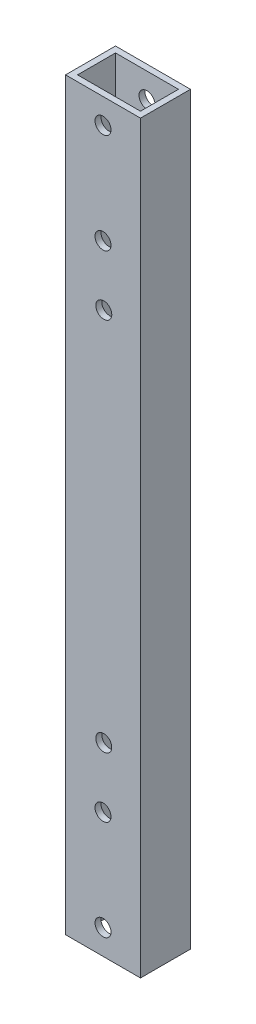
ISO-10303-21;
HEADER;
FILE_DESCRIPTION(('STEP AP214'),'2;1');
FILE_NAME('part.step','',(''),(''),'','','');
FILE_SCHEMA(('AUTOMOTIVE_DESIGN { 1 0 10303 214 1 1 1 1 }'));
ENDSEC;
DATA;
#1=APPLICATION_CONTEXT('core data for automotive mechanical design processes');
#2=APPLICATION_PROTOCOL_DEFINITION('international standard','automotive_design',2000,#1);
#3=PRODUCT_CONTEXT('',#1,'mechanical');
#4=PRODUCT('Part','Part','',(#3));
#5=PRODUCT_RELATED_PRODUCT_CATEGORY('part','',(#4));
#6=PRODUCT_DEFINITION_FORMATION('','',#4);
#7=PRODUCT_DEFINITION_CONTEXT('part definition',#1,'design');
#8=PRODUCT_DEFINITION('design','',#6,#7);
#9=PRODUCT_DEFINITION_SHAPE('','',#8);
#10=(LENGTH_UNIT() NAMED_UNIT(*) SI_UNIT(.MILLI.,.METRE.));
#11=(NAMED_UNIT(*) PLANE_ANGLE_UNIT() SI_UNIT($,.RADIAN.));
#12=(NAMED_UNIT(*) SI_UNIT($,.STERADIAN.) SOLID_ANGLE_UNIT());
#13=UNCERTAINTY_MEASURE_WITH_UNIT(LENGTH_MEASURE(1.E-05),#10,'distance_accuracy_value','');
#14=(GEOMETRIC_REPRESENTATION_CONTEXT(3) GLOBAL_UNCERTAINTY_ASSIGNED_CONTEXT((#13)) GLOBAL_UNIT_ASSIGNED_CONTEXT((#10,
#11,#12)) REPRESENTATION_CONTEXT('',''));
#15=CARTESIAN_POINT('',(0.,0.,0.));
#16=DIRECTION('',(0.,0.,1.));
#17=DIRECTION('',(1.,0.,0.));
#18=AXIS2_PLACEMENT_3D('',#15,#16,#17);
#19=CARTESIAN_POINT('',(0.,74.51,0.));
#20=DIRECTION('',(0.,1.,0.));
#21=DIRECTION('',(0.,0.,1.));
#22=AXIS2_PLACEMENT_3D('',#19,#20,#21);
#23=PLANE('',#22);
#24=DIRECTION('',(0.,0.,-1.));
#25=VECTOR('',#24,1.);
#26=CARTESIAN_POINT('',(7.5,74.51,-5.));
#27=LINE('',#26,#25);
#28=CARTESIAN_POINT('',(7.5,74.51,5.));
#29=VERTEX_POINT('',#28);
#30=CARTESIAN_POINT('',(7.5,74.51,-5.));
#31=VERTEX_POINT('',#30);
#32=EDGE_CURVE('E163',#29,#31,#27,.T.);
#33=ORIENTED_EDGE('',*,*,#32,.T.);
#34=DIRECTION('',(-1.,0.,0.));
#35=VECTOR('',#34,1.);
#36=CARTESIAN_POINT('',(-7.5,74.51,-5.));
#37=LINE('',#36,#35);
#38=CARTESIAN_POINT('',(-7.5,74.51,-5.));
#39=VERTEX_POINT('',#38);
#40=EDGE_CURVE('E167',#31,#39,#37,.T.);
#41=ORIENTED_EDGE('',*,*,#40,.T.);
#42=DIRECTION('',(0.,0.,1.));
#43=VECTOR('',#42,1.);
#44=CARTESIAN_POINT('',(-7.5,74.51,-5.));
#45=LINE('',#44,#43);
#46=CARTESIAN_POINT('',(-7.5,74.51,5.));
#47=VERTEX_POINT('',#46);
#48=EDGE_CURVE('E171',#39,#47,#45,.T.);
#49=ORIENTED_EDGE('',*,*,#48,.T.);
#50=DIRECTION('',(1.,0.,0.));
#51=VECTOR('',#50,1.);
#52=CARTESIAN_POINT('',(-7.5,74.51,5.));
#53=LINE('',#52,#51);
#54=EDGE_CURVE('E174',#47,#29,#53,.T.);
#55=ORIENTED_EDGE('',*,*,#54,.T.);
#56=EDGE_LOOP('',(#33,#41,#49,#55));
#57=FACE_BOUND('',#56,.T.);
#58=DIRECTION('',(1.,0.,0.));
#59=VECTOR('',#58,1.);
#60=CARTESIAN_POINT('',(-6.3,74.51,3.8));
#61=LINE('',#60,#59);
#62=CARTESIAN_POINT('',(-6.3,74.51,3.8));
#63=VERTEX_POINT('',#62);
#64=CARTESIAN_POINT('',(6.3,74.51,3.8));
#65=VERTEX_POINT('',#64);
#66=EDGE_CURVE('E122',#63,#65,#61,.T.);
#67=ORIENTED_EDGE('',*,*,#66,.F.);
#68=DIRECTION('',(0.,0.,1.));
#69=VECTOR('',#68,1.);
#70=CARTESIAN_POINT('',(-6.3,74.51,-3.8));
#71=LINE('',#70,#69);
#72=CARTESIAN_POINT('',(-6.3,74.51,-3.8));
#73=VERTEX_POINT('',#72);
#74=EDGE_CURVE('E113',#73,#63,#71,.T.);
#75=ORIENTED_EDGE('',*,*,#74,.F.);
#76=DIRECTION('',(-1.,0.,0.));
#77=VECTOR('',#76,1.);
#78=CARTESIAN_POINT('',(-6.3,74.51,-3.8));
#79=LINE('',#78,#77);
#80=CARTESIAN_POINT('',(6.3,74.51,-3.8));
#81=VERTEX_POINT('',#80);
#82=EDGE_CURVE('E139',#81,#73,#79,.T.);
#83=ORIENTED_EDGE('',*,*,#82,.F.);
#84=DIRECTION('',(0.,0.,-1.));
#85=VECTOR('',#84,1.);
#86=CARTESIAN_POINT('',(6.3,74.51,-3.8));
#87=LINE('',#86,#85);
#88=EDGE_CURVE('E135',#65,#81,#87,.T.);
#89=ORIENTED_EDGE('',*,*,#88,.F.);
#90=EDGE_LOOP('',(#67,#75,#83,#89));
#91=FACE_BOUND('',#90,.T.);
#92=ADVANCED_FACE('F45',(#57,#91),#23,.T.);
#93=CARTESIAN_POINT('',(0.,-74.51,0.));
#94=DIRECTION('',(0.,1.,0.));
#95=DIRECTION('',(0.,0.,1.));
#96=AXIS2_PLACEMENT_3D('',#93,#94,#95);
#97=PLANE('',#96);
#98=DIRECTION('',(0.,0.,-1.));
#99=VECTOR('',#98,1.);
#100=CARTESIAN_POINT('',(7.5,-74.51,-5.));
#101=LINE('',#100,#99);
#102=CARTESIAN_POINT('',(7.5,-74.51,5.));
#103=VERTEX_POINT('',#102);
#104=CARTESIAN_POINT('',(7.5,-74.51,-5.));
#105=VERTEX_POINT('',#104);
#106=EDGE_CURVE('E131',#103,#105,#101,.T.);
#107=ORIENTED_EDGE('',*,*,#106,.F.);
#108=DIRECTION('',(1.,0.,0.));
#109=VECTOR('',#108,1.);
#110=CARTESIAN_POINT('',(-7.5,-74.51,5.));
#111=LINE('',#110,#109);
#112=CARTESIAN_POINT('',(-7.5,-74.51,5.));
#113=VERTEX_POINT('',#112);
#114=EDGE_CURVE('E168',#113,#103,#111,.T.);
#115=ORIENTED_EDGE('',*,*,#114,.F.);
#116=DIRECTION('',(0.,0.,1.));
#117=VECTOR('',#116,1.);
#118=CARTESIAN_POINT('',(-7.5,-74.51,-5.));
#119=LINE('',#118,#117);
#120=CARTESIAN_POINT('',(-7.5,-74.51,-5.));
#121=VERTEX_POINT('',#120);
#122=EDGE_CURVE('E184',#121,#113,#119,.T.);
#123=ORIENTED_EDGE('',*,*,#122,.F.);
#124=DIRECTION('',(-1.,0.,0.));
#125=VECTOR('',#124,1.);
#126=CARTESIAN_POINT('',(-7.5,-74.51,-5.));
#127=LINE('',#126,#125);
#128=EDGE_CURVE('E181',#105,#121,#127,.T.);
#129=ORIENTED_EDGE('',*,*,#128,.F.);
#130=EDGE_LOOP('',(#107,#115,#123,#129));
#131=FACE_BOUND('',#130,.T.);
#132=DIRECTION('',(0.,0.,1.));
#133=VECTOR('',#132,1.);
#134=CARTESIAN_POINT('',(-6.3,-74.51,-3.8));
#135=LINE('',#134,#133);
#136=CARTESIAN_POINT('',(-6.3,-74.51,-3.8));
#137=VERTEX_POINT('',#136);
#138=CARTESIAN_POINT('',(-6.3,-74.51,3.8));
#139=VERTEX_POINT('',#138);
#140=EDGE_CURVE('E71',#137,#139,#135,.T.);
#141=ORIENTED_EDGE('',*,*,#140,.T.);
#142=DIRECTION('',(1.,0.,0.));
#143=VECTOR('',#142,1.);
#144=CARTESIAN_POINT('',(-6.3,-74.51,3.8));
#145=LINE('',#144,#143);
#146=CARTESIAN_POINT('',(6.3,-74.51,3.8));
#147=VERTEX_POINT('',#146);
#148=EDGE_CURVE('E129',#139,#147,#145,.T.);
#149=ORIENTED_EDGE('',*,*,#148,.T.);
#150=DIRECTION('',(0.,0.,-1.));
#151=VECTOR('',#150,1.);
#152=CARTESIAN_POINT('',(6.3,-74.51,-3.8));
#153=LINE('',#152,#151);
#154=CARTESIAN_POINT('',(6.3,-74.51,-3.8));
#155=VERTEX_POINT('',#154);
#156=EDGE_CURVE('E150',#147,#155,#153,.T.);
#157=ORIENTED_EDGE('',*,*,#156,.T.);
#158=DIRECTION('',(-1.,0.,0.));
#159=VECTOR('',#158,1.);
#160=CARTESIAN_POINT('',(-6.3,-74.51,-3.8));
#161=LINE('',#160,#159);
#162=EDGE_CURVE('E123',#155,#137,#161,.T.);
#163=ORIENTED_EDGE('',*,*,#162,.T.);
#164=EDGE_LOOP('',(#141,#149,#157,#163));
#165=FACE_BOUND('',#164,.T.);
#166=ADVANCED_FACE('F326',(#131,#165),#97,.F.);
#167=CARTESIAN_POINT('',(7.5,74.51,-5.));
#168=DIRECTION('',(-1.,0.,0.));
#169=DIRECTION('',(0.,0.,1.));
#170=AXIS2_PLACEMENT_3D('',#167,#168,#169);
#171=PLANE('',#170);
#172=ORIENTED_EDGE('',*,*,#106,.T.);
#173=DIRECTION('',(0.,-1.,0.));
#174=VECTOR('',#173,1.);
#175=CARTESIAN_POINT('',(7.5,74.51,-5.));
#176=LINE('',#175,#174);
#177=EDGE_CURVE('E11',#31,#105,#176,.T.);
#178=ORIENTED_EDGE('',*,*,#177,.F.);
#179=ORIENTED_EDGE('',*,*,#32,.F.);
#180=DIRECTION('',(0.,-1.,0.));
#181=VECTOR('',#180,1.);
#182=CARTESIAN_POINT('',(7.5,74.51,5.));
#183=LINE('',#182,#181);
#184=EDGE_CURVE('E177',#29,#103,#183,.T.);
#185=ORIENTED_EDGE('',*,*,#184,.T.);
#186=EDGE_LOOP('',(#172,#178,#179,#185));
#187=FACE_BOUND('',#186,.T.);
#188=ADVANCED_FACE('F47',(#187),#171,.F.);
#189=CARTESIAN_POINT('',(-7.5,74.51,-5.));
#190=DIRECTION('',(0.,0.,1.));
#191=DIRECTION('',(1.,0.,0.));
#192=AXIS2_PLACEMENT_3D('',#189,#190,#191);
#193=PLANE('',#192);
#194=CARTESIAN_POINT('',(0.154999999999378,37.5790580479988,-5.));
#195=DIRECTION('',(0.,0.,-1.));
#196=DIRECTION('',(-1.,0.,0.));
#197=AXIS2_PLACEMENT_3D('',#194,#195,#196);
#198=CIRCLE('',#197,1.6);
#199=CARTESIAN_POINT('',(-1.44500000000063,37.5790580479988,-5.));
#200=VERTEX_POINT('',#199);
#201=EDGE_CURVE('E231',#200,#200,#198,.T.);
#202=ORIENTED_EDGE('',*,*,#201,.F.);
#203=EDGE_LOOP('',(#202));
#204=FACE_BOUND('',#203,.T.);
#205=CARTESIAN_POINT('',(0.150000601940453,-37.4209419520413,-5.));
#206=DIRECTION('',(0.,0.,-1.));
#207=DIRECTION('',(-1.,0.,0.));
#208=AXIS2_PLACEMENT_3D('',#205,#206,#207);
#209=CIRCLE('',#208,1.6);
#210=CARTESIAN_POINT('',(-1.44999939805955,-37.4209419520413,-5.));
#211=VERTEX_POINT('',#210);
#212=EDGE_CURVE('E237',#211,#211,#209,.T.);
#213=ORIENTED_EDGE('',*,*,#212,.F.);
#214=EDGE_LOOP('',(#213));
#215=FACE_BOUND('',#214,.T.);
#216=CARTESIAN_POINT('',(0.,-49.51,-5.));
#217=DIRECTION('',(0.,0.,-1.));
#218=DIRECTION('',(1.,0.,0.));
#219=AXIS2_PLACEMENT_3D('',#216,#217,#218);
#220=CIRCLE('',#219,1.6);
#221=CARTESIAN_POINT('',(1.6,-49.51,-5.));
#222=VERTEX_POINT('',#221);
#223=EDGE_CURVE('E214',#222,#222,#220,.T.);
#224=ORIENTED_EDGE('',*,*,#223,.F.);
#225=EDGE_LOOP('',(#224));
#226=FACE_BOUND('',#225,.T.);
#227=CARTESIAN_POINT('',(0.,-69.51,-5.));
#228=DIRECTION('',(0.,0.,-1.));
#229=DIRECTION('',(1.,0.,0.));
#230=AXIS2_PLACEMENT_3D('',#227,#228,#229);
#231=CIRCLE('',#230,1.6);
#232=CARTESIAN_POINT('',(1.6,-69.51,-5.));
#233=VERTEX_POINT('',#232);
#234=EDGE_CURVE('E259',#233,#233,#231,.T.);
#235=ORIENTED_EDGE('',*,*,#234,.F.);
#236=EDGE_LOOP('',(#235));
#237=FACE_BOUND('',#236,.T.);
#238=CARTESIAN_POINT('',(0.,49.51,-5.));
#239=DIRECTION('',(0.,0.,1.));
#240=DIRECTION('',(1.,0.,0.));
#241=AXIS2_PLACEMENT_3D('',#238,#239,#240);
#242=CIRCLE('',#241,1.6);
#243=CARTESIAN_POINT('',(1.6,49.51,-5.));
#244=VERTEX_POINT('',#243);
#245=EDGE_CURVE('E204',#244,#244,#242,.T.);
#246=ORIENTED_EDGE('',*,*,#245,.T.);
#247=EDGE_LOOP('',(#246));
#248=FACE_BOUND('',#247,.T.);
#249=CARTESIAN_POINT('',(0.,69.51,-5.));
#250=DIRECTION('',(0.,0.,1.));
#251=DIRECTION('',(1.,0.,0.));
#252=AXIS2_PLACEMENT_3D('',#249,#250,#251);
#253=CIRCLE('',#252,1.6);
#254=CARTESIAN_POINT('',(1.6,69.51,-5.));
#255=VERTEX_POINT('',#254);
#256=EDGE_CURVE('E280',#255,#255,#253,.T.);
#257=ORIENTED_EDGE('',*,*,#256,.T.);
#258=EDGE_LOOP('',(#257));
#259=FACE_BOUND('',#258,.T.);
#260=ORIENTED_EDGE('',*,*,#128,.T.);
#261=DIRECTION('',(0.,-1.,0.));
#262=VECTOR('',#261,1.);
#263=CARTESIAN_POINT('',(-7.5,74.51,-5.));
#264=LINE('',#263,#262);
#265=EDGE_CURVE('E55',#39,#121,#264,.T.);
#266=ORIENTED_EDGE('',*,*,#265,.F.);
#267=ORIENTED_EDGE('',*,*,#40,.F.);
#268=ORIENTED_EDGE('',*,*,#177,.T.);
#269=EDGE_LOOP('',(#260,#266,#267,#268));
#270=FACE_BOUND('',#269,.T.);
#271=ADVANCED_FACE('F330',(#204,#215,#226,#237,#248,#259,#270),#193,.F.);
#272=CARTESIAN_POINT('',(-7.5,74.51,-5.));
#273=DIRECTION('',(1.,0.,0.));
#274=DIRECTION('',(0.,0.,-1.));
#275=AXIS2_PLACEMENT_3D('',#272,#273,#274);
#276=PLANE('',#275);
#277=ORIENTED_EDGE('',*,*,#122,.T.);
#278=DIRECTION('',(0.,-1.,0.));
#279=VECTOR('',#278,1.);
#280=CARTESIAN_POINT('',(-7.5,74.51,5.));
#281=LINE('',#280,#279);
#282=EDGE_CURVE('E192',#47,#113,#281,.T.);
#283=ORIENTED_EDGE('',*,*,#282,.F.);
#284=ORIENTED_EDGE('',*,*,#48,.F.);
#285=ORIENTED_EDGE('',*,*,#265,.T.);
#286=EDGE_LOOP('',(#277,#283,#284,#285));
#287=FACE_BOUND('',#286,.T.);
#288=ADVANCED_FACE('F314',(#287),#276,.F.);
#289=CARTESIAN_POINT('',(-7.5,74.51,5.));
#290=DIRECTION('',(0.,0.,-1.));
#291=DIRECTION('',(-1.,0.,0.));
#292=AXIS2_PLACEMENT_3D('',#289,#290,#291);
#293=PLANE('',#292);
#294=CARTESIAN_POINT('',(0.154999999999378,37.5790580479988,5.));
#295=DIRECTION('',(0.,0.,-1.));
#296=DIRECTION('',(-1.,0.,0.));
#297=AXIS2_PLACEMENT_3D('',#294,#295,#296);
#298=CIRCLE('',#297,1.6);
#299=CARTESIAN_POINT('',(-1.44500000000063,37.5790580479988,5.));
#300=VERTEX_POINT('',#299);
#301=EDGE_CURVE('E223',#300,#300,#298,.T.);
#302=ORIENTED_EDGE('',*,*,#301,.T.);
#303=EDGE_LOOP('',(#302));
#304=FACE_BOUND('',#303,.T.);
#305=CARTESIAN_POINT('',(0.150000601940453,-37.4209419520413,5.));
#306=DIRECTION('',(0.,0.,-1.));
#307=DIRECTION('',(-1.,0.,0.));
#308=AXIS2_PLACEMENT_3D('',#305,#306,#307);
#309=CIRCLE('',#308,1.6);
#310=CARTESIAN_POINT('',(-1.44999939805955,-37.4209419520413,5.));
#311=VERTEX_POINT('',#310);
#312=EDGE_CURVE('E243',#311,#311,#309,.T.);
#313=ORIENTED_EDGE('',*,*,#312,.T.);
#314=EDGE_LOOP('',(#313));
#315=FACE_BOUND('',#314,.T.);
#316=CARTESIAN_POINT('',(0.,-49.51,5.));
#317=DIRECTION('',(0.,0.,-1.));
#318=DIRECTION('',(1.,0.,0.));
#319=AXIS2_PLACEMENT_3D('',#316,#317,#318);
#320=CIRCLE('',#319,1.6);
#321=CARTESIAN_POINT('',(1.6,-49.51,5.));
#322=VERTEX_POINT('',#321);
#323=EDGE_CURVE('E255',#322,#322,#320,.T.);
#324=ORIENTED_EDGE('',*,*,#323,.T.);
#325=EDGE_LOOP('',(#324));
#326=FACE_BOUND('',#325,.T.);
#327=CARTESIAN_POINT('',(0.,-69.51,5.));
#328=DIRECTION('',(0.,0.,-1.));
#329=DIRECTION('',(1.,0.,0.));
#330=AXIS2_PLACEMENT_3D('',#327,#328,#329);
#331=CIRCLE('',#330,1.6);
#332=CARTESIAN_POINT('',(1.6,-69.51,5.));
#333=VERTEX_POINT('',#332);
#334=EDGE_CURVE('E251',#333,#333,#331,.T.);
#335=ORIENTED_EDGE('',*,*,#334,.T.);
#336=EDGE_LOOP('',(#335));
#337=FACE_BOUND('',#336,.T.);
#338=CARTESIAN_POINT('',(0.,49.51,5.));
#339=DIRECTION('',(0.,0.,1.));
#340=DIRECTION('',(1.,0.,0.));
#341=AXIS2_PLACEMENT_3D('',#338,#339,#340);
#342=CIRCLE('',#341,1.6);
#343=CARTESIAN_POINT('',(1.6,49.51,5.));
#344=VERTEX_POINT('',#343);
#345=EDGE_CURVE('E276',#344,#344,#342,.T.);
#346=ORIENTED_EDGE('',*,*,#345,.F.);
#347=EDGE_LOOP('',(#346));
#348=FACE_BOUND('',#347,.T.);
#349=CARTESIAN_POINT('',(0.,69.51,5.));
#350=DIRECTION('',(0.,0.,1.));
#351=DIRECTION('',(1.,0.,0.));
#352=AXIS2_PLACEMENT_3D('',#349,#350,#351);
#353=CIRCLE('',#352,1.6);
#354=CARTESIAN_POINT('',(1.6,69.51,5.));
#355=VERTEX_POINT('',#354);
#356=EDGE_CURVE('E272',#355,#355,#353,.T.);
#357=ORIENTED_EDGE('',*,*,#356,.F.);
#358=EDGE_LOOP('',(#357));
#359=FACE_BOUND('',#358,.T.);
#360=ORIENTED_EDGE('',*,*,#114,.T.);
#361=ORIENTED_EDGE('',*,*,#184,.F.);
#362=ORIENTED_EDGE('',*,*,#54,.F.);
#363=ORIENTED_EDGE('',*,*,#282,.T.);
#364=EDGE_LOOP('',(#360,#361,#362,#363));
#365=FACE_BOUND('',#364,.T.);
#366=ADVANCED_FACE('F311',(#304,#315,#326,#337,#348,#359,#365),#293,.F.);
#367=CARTESIAN_POINT('',(-6.3,74.51,-3.8));
#368=DIRECTION('',(1.,0.,0.));
#369=DIRECTION('',(0.,0.,-1.));
#370=AXIS2_PLACEMENT_3D('',#367,#368,#369);
#371=PLANE('',#370);
#372=ORIENTED_EDGE('',*,*,#140,.F.);
#373=DIRECTION('',(0.,-1.,0.));
#374=VECTOR('',#373,1.);
#375=CARTESIAN_POINT('',(-6.3,74.51,-3.8));
#376=LINE('',#375,#374);
#377=EDGE_CURVE('E117',#73,#137,#376,.T.);
#378=ORIENTED_EDGE('',*,*,#377,.F.);
#379=ORIENTED_EDGE('',*,*,#74,.T.);
#380=DIRECTION('',(0.,-1.,0.));
#381=VECTOR('',#380,1.);
#382=CARTESIAN_POINT('',(-6.3,74.51,3.8));
#383=LINE('',#382,#381);
#384=EDGE_CURVE('E116',#63,#139,#383,.T.);
#385=ORIENTED_EDGE('',*,*,#384,.T.);
#386=EDGE_LOOP('',(#372,#378,#379,#385));
#387=FACE_BOUND('',#386,.T.);
#388=ADVANCED_FACE('F115',(#387),#371,.T.);
#389=CARTESIAN_POINT('',(-6.3,74.51,3.8));
#390=DIRECTION('',(0.,0.,-1.));
#391=DIRECTION('',(-1.,0.,0.));
#392=AXIS2_PLACEMENT_3D('',#389,#390,#391);
#393=PLANE('',#392);
#394=CARTESIAN_POINT('',(0.154999999999378,37.5790580479988,3.8));
#395=DIRECTION('',(0.,0.,-1.));
#396=DIRECTION('',(-1.,0.,0.));
#397=AXIS2_PLACEMENT_3D('',#394,#395,#396);
#398=CIRCLE('',#397,1.6);
#399=CARTESIAN_POINT('',(-1.44500000000063,37.5790580479988,3.8));
#400=VERTEX_POINT('',#399);
#401=EDGE_CURVE('E247',#400,#400,#398,.T.);
#402=ORIENTED_EDGE('',*,*,#401,.F.);
#403=EDGE_LOOP('',(#402));
#404=FACE_BOUND('',#403,.T.);
#405=CARTESIAN_POINT('',(0.150000601940453,-37.4209419520413,3.8));
#406=DIRECTION('',(0.,0.,-1.));
#407=DIRECTION('',(-1.,0.,0.));
#408=AXIS2_PLACEMENT_3D('',#405,#406,#407);
#409=CIRCLE('',#408,1.6);
#410=CARTESIAN_POINT('',(-1.44999939805955,-37.4209419520413,3.8));
#411=VERTEX_POINT('',#410);
#412=EDGE_CURVE('E222',#411,#411,#409,.T.);
#413=ORIENTED_EDGE('',*,*,#412,.F.);
#414=EDGE_LOOP('',(#413));
#415=FACE_BOUND('',#414,.T.);
#416=CARTESIAN_POINT('',(0.,-49.51,3.8));
#417=DIRECTION('',(0.,0.,-1.));
#418=DIRECTION('',(-1.,0.,0.));
#419=AXIS2_PLACEMENT_3D('',#416,#417,#418);
#420=CIRCLE('',#419,1.6);
#421=CARTESIAN_POINT('',(-1.6,-49.51,3.8));
#422=VERTEX_POINT('',#421);
#423=EDGE_CURVE('E218',#422,#422,#420,.F.);
#424=ORIENTED_EDGE('',*,*,#423,.T.);
#425=EDGE_LOOP('',(#424));
#426=FACE_BOUND('',#425,.T.);
#427=CARTESIAN_POINT('',(0.,-69.51,3.8));
#428=DIRECTION('',(0.,0.,-1.));
#429=DIRECTION('',(-1.,0.,0.));
#430=AXIS2_PLACEMENT_3D('',#427,#428,#429);
#431=CIRCLE('',#430,1.6);
#432=CARTESIAN_POINT('',(-1.6,-69.51,3.8));
#433=VERTEX_POINT('',#432);
#434=EDGE_CURVE('E213',#433,#433,#431,.F.);
#435=ORIENTED_EDGE('',*,*,#434,.T.);
#436=EDGE_LOOP('',(#435));
#437=FACE_BOUND('',#436,.T.);
#438=CARTESIAN_POINT('',(0.,49.51,3.8));
#439=DIRECTION('',(0.,0.,-1.));
#440=DIRECTION('',(-1.,0.,0.));
#441=AXIS2_PLACEMENT_3D('',#438,#439,#440);
#442=CIRCLE('',#441,1.6);
#443=CARTESIAN_POINT('',(-1.6,49.51,3.8));
#444=VERTEX_POINT('',#443);
#445=EDGE_CURVE('E147',#444,#444,#442,.T.);
#446=ORIENTED_EDGE('',*,*,#445,.F.);
#447=EDGE_LOOP('',(#446));
#448=FACE_BOUND('',#447,.T.);
#449=CARTESIAN_POINT('',(0.,69.51,3.8));
#450=DIRECTION('',(0.,0.,-1.));
#451=DIRECTION('',(-1.,0.,0.));
#452=AXIS2_PLACEMENT_3D('',#449,#450,#451);
#453=CIRCLE('',#452,1.6);
#454=CARTESIAN_POINT('',(-1.6,69.51,3.8));
#455=VERTEX_POINT('',#454);
#456=EDGE_CURVE('E203',#455,#455,#453,.T.);
#457=ORIENTED_EDGE('',*,*,#456,.F.);
#458=EDGE_LOOP('',(#457));
#459=FACE_BOUND('',#458,.T.);
#460=ORIENTED_EDGE('',*,*,#148,.F.);
#461=ORIENTED_EDGE('',*,*,#384,.F.);
#462=ORIENTED_EDGE('',*,*,#66,.T.);
#463=DIRECTION('',(0.,-1.,0.));
#464=VECTOR('',#463,1.);
#465=CARTESIAN_POINT('',(6.3,74.51,3.8));
#466=LINE('',#465,#464);
#467=EDGE_CURVE('E132',#65,#147,#466,.T.);
#468=ORIENTED_EDGE('',*,*,#467,.T.);
#469=EDGE_LOOP('',(#460,#461,#462,#468));
#470=FACE_BOUND('',#469,.T.);
#471=ADVANCED_FACE('F126',(#404,#415,#426,#437,#448,#459,#470),#393,.T.);
#472=CARTESIAN_POINT('',(6.3,74.51,-3.8));
#473=DIRECTION('',(-1.,0.,0.));
#474=DIRECTION('',(0.,0.,1.));
#475=AXIS2_PLACEMENT_3D('',#472,#473,#474);
#476=PLANE('',#475);
#477=ORIENTED_EDGE('',*,*,#156,.F.);
#478=ORIENTED_EDGE('',*,*,#467,.F.);
#479=ORIENTED_EDGE('',*,*,#88,.T.);
#480=DIRECTION('',(0.,-1.,0.));
#481=VECTOR('',#480,1.);
#482=CARTESIAN_POINT('',(6.3,74.51,-3.8));
#483=LINE('',#482,#481);
#484=EDGE_CURVE('E63',#81,#155,#483,.T.);
#485=ORIENTED_EDGE('',*,*,#484,.T.);
#486=EDGE_LOOP('',(#477,#478,#479,#485));
#487=FACE_BOUND('',#486,.T.);
#488=ADVANCED_FACE('F298',(#487),#476,.T.);
#489=CARTESIAN_POINT('',(-6.3,74.51,-3.8));
#490=DIRECTION('',(0.,0.,1.));
#491=DIRECTION('',(1.,0.,0.));
#492=AXIS2_PLACEMENT_3D('',#489,#490,#491);
#493=PLANE('',#492);
#494=CARTESIAN_POINT('',(0.154999999999378,37.5790580479988,-3.8));
#495=DIRECTION('',(0.,0.,1.));
#496=DIRECTION('',(1.,0.,0.));
#497=AXIS2_PLACEMENT_3D('',#494,#495,#496);
#498=CIRCLE('',#497,1.6);
#499=CARTESIAN_POINT('',(1.75499999999938,37.5790580479988,-3.8));
#500=VERTEX_POINT('',#499);
#501=EDGE_CURVE('E49',#500,#500,#498,.T.);
#502=ORIENTED_EDGE('',*,*,#501,.F.);
#503=EDGE_LOOP('',(#502));
#504=FACE_BOUND('',#503,.T.);
#505=CARTESIAN_POINT('',(0.150000601940453,-37.4209419520413,-3.8));
#506=DIRECTION('',(0.,0.,1.));
#507=DIRECTION('',(1.,0.,0.));
#508=AXIS2_PLACEMENT_3D('',#505,#506,#507);
#509=CIRCLE('',#508,1.6);
#510=CARTESIAN_POINT('',(1.75000060194046,-37.4209419520413,-3.8));
#511=VERTEX_POINT('',#510);
#512=EDGE_CURVE('E219',#511,#511,#509,.T.);
#513=ORIENTED_EDGE('',*,*,#512,.F.);
#514=EDGE_LOOP('',(#513));
#515=FACE_BOUND('',#514,.T.);
#516=CARTESIAN_POINT('',(0.,-49.51,-3.8));
#517=DIRECTION('',(0.,0.,1.));
#518=DIRECTION('',(1.,0.,0.));
#519=AXIS2_PLACEMENT_3D('',#516,#517,#518);
#520=CIRCLE('',#519,1.6);
#521=CARTESIAN_POINT('',(1.6,-49.51,-3.8));
#522=VERTEX_POINT('',#521);
#523=EDGE_CURVE('E215',#522,#522,#520,.F.);
#524=ORIENTED_EDGE('',*,*,#523,.T.);
#525=EDGE_LOOP('',(#524));
#526=FACE_BOUND('',#525,.T.);
#527=CARTESIAN_POINT('',(0.,-69.51,-3.8));
#528=DIRECTION('',(0.,0.,1.));
#529=DIRECTION('',(1.,0.,0.));
#530=AXIS2_PLACEMENT_3D('',#527,#528,#529);
#531=CIRCLE('',#530,1.6);
#532=CARTESIAN_POINT('',(1.6,-69.51,-3.8));
#533=VERTEX_POINT('',#532);
#534=EDGE_CURVE('E209',#533,#533,#531,.F.);
#535=ORIENTED_EDGE('',*,*,#534,.T.);
#536=EDGE_LOOP('',(#535));
#537=FACE_BOUND('',#536,.T.);
#538=CARTESIAN_POINT('',(0.,49.51,-3.8));
#539=DIRECTION('',(0.,0.,1.));
#540=DIRECTION('',(1.,0.,0.));
#541=AXIS2_PLACEMENT_3D('',#538,#539,#540);
#542=CIRCLE('',#541,1.6);
#543=CARTESIAN_POINT('',(1.6,49.51,-3.8));
#544=VERTEX_POINT('',#543);
#545=EDGE_CURVE('E205',#544,#544,#542,.T.);
#546=ORIENTED_EDGE('',*,*,#545,.F.);
#547=EDGE_LOOP('',(#546));
#548=FACE_BOUND('',#547,.T.);
#549=CARTESIAN_POINT('',(0.,69.51,-3.8));
#550=DIRECTION('',(0.,0.,1.));
#551=DIRECTION('',(1.,0.,0.));
#552=AXIS2_PLACEMENT_3D('',#549,#550,#551);
#553=CIRCLE('',#552,1.6);
#554=CARTESIAN_POINT('',(1.6,69.51,-3.8));
#555=VERTEX_POINT('',#554);
#556=EDGE_CURVE('E199',#555,#555,#553,.T.);
#557=ORIENTED_EDGE('',*,*,#556,.F.);
#558=EDGE_LOOP('',(#557));
#559=FACE_BOUND('',#558,.T.);
#560=ORIENTED_EDGE('',*,*,#162,.F.);
#561=ORIENTED_EDGE('',*,*,#484,.F.);
#562=ORIENTED_EDGE('',*,*,#82,.T.);
#563=ORIENTED_EDGE('',*,*,#377,.T.);
#564=EDGE_LOOP('',(#560,#561,#562,#563));
#565=FACE_BOUND('',#564,.T.);
#566=ADVANCED_FACE('F352',(#504,#515,#526,#537,#548,#559,#565),#493,.T.);
#567=CARTESIAN_POINT('',(0.,69.51,-5.));
#568=DIRECTION('',(0.,0.,1.));
#569=DIRECTION('',(1.,0.,0.));
#570=AXIS2_PLACEMENT_3D('',#567,#568,#569);
#571=CYLINDRICAL_SURFACE('',#570,1.6);
#572=ORIENTED_EDGE('',*,*,#556,.T.);
#573=EDGE_LOOP('',(#572));
#574=FACE_BOUND('',#573,.T.);
#575=ORIENTED_EDGE('',*,*,#256,.F.);
#576=EDGE_LOOP('',(#575));
#577=FACE_BOUND('',#576,.T.);
#578=ADVANCED_FACE('F308',(#574,#577),#571,.F.);
#579=CARTESIAN_POINT('',(0.,49.51,-5.));
#580=DIRECTION('',(0.,0.,1.));
#581=DIRECTION('',(1.,0.,0.));
#582=AXIS2_PLACEMENT_3D('',#579,#580,#581);
#583=CYLINDRICAL_SURFACE('',#582,1.6);
#584=ORIENTED_EDGE('',*,*,#545,.T.);
#585=EDGE_LOOP('',(#584));
#586=FACE_BOUND('',#585,.T.);
#587=ORIENTED_EDGE('',*,*,#245,.F.);
#588=EDGE_LOOP('',(#587));
#589=FACE_BOUND('',#588,.T.);
#590=ADVANCED_FACE('F306',(#586,#589),#583,.F.);
#591=ORIENTED_EDGE('',*,*,#456,.T.);
#592=EDGE_LOOP('',(#591));
#593=FACE_BOUND('',#592,.T.);
#594=ORIENTED_EDGE('',*,*,#356,.T.);
#595=EDGE_LOOP('',(#594));
#596=FACE_BOUND('',#595,.T.);
#597=ADVANCED_FACE('F303',(#593,#596),#571,.F.);
#598=ORIENTED_EDGE('',*,*,#445,.T.);
#599=EDGE_LOOP('',(#598));
#600=FACE_BOUND('',#599,.T.);
#601=ORIENTED_EDGE('',*,*,#345,.T.);
#602=EDGE_LOOP('',(#601));
#603=FACE_BOUND('',#602,.T.);
#604=ADVANCED_FACE('F293',(#600,#603),#583,.F.);
#605=CARTESIAN_POINT('',(0.,-69.51,-5.));
#606=DIRECTION('',(0.,0.,1.));
#607=DIRECTION('',(1.,0.,0.));
#608=AXIS2_PLACEMENT_3D('',#605,#606,#607);
#609=CYLINDRICAL_SURFACE('',#608,1.6);
#610=ORIENTED_EDGE('',*,*,#534,.F.);
#611=EDGE_LOOP('',(#610));
#612=FACE_BOUND('',#611,.T.);
#613=ORIENTED_EDGE('',*,*,#234,.T.);
#614=EDGE_LOOP('',(#613));
#615=FACE_BOUND('',#614,.T.);
#616=ADVANCED_FACE('F362',(#612,#615),#609,.F.);
#617=CARTESIAN_POINT('',(0.,-49.51,-5.));
#618=DIRECTION('',(0.,0.,1.));
#619=DIRECTION('',(1.,0.,0.));
#620=AXIS2_PLACEMENT_3D('',#617,#618,#619);
#621=CYLINDRICAL_SURFACE('',#620,1.6);
#622=ORIENTED_EDGE('',*,*,#523,.F.);
#623=EDGE_LOOP('',(#622));
#624=FACE_BOUND('',#623,.T.);
#625=ORIENTED_EDGE('',*,*,#223,.T.);
#626=EDGE_LOOP('',(#625));
#627=FACE_BOUND('',#626,.T.);
#628=ADVANCED_FACE('F365',(#624,#627),#621,.F.);
#629=ORIENTED_EDGE('',*,*,#434,.F.);
#630=EDGE_LOOP('',(#629));
#631=FACE_BOUND('',#630,.T.);
#632=ORIENTED_EDGE('',*,*,#334,.F.);
#633=EDGE_LOOP('',(#632));
#634=FACE_BOUND('',#633,.T.);
#635=ADVANCED_FACE('F367',(#631,#634),#609,.F.);
#636=ORIENTED_EDGE('',*,*,#423,.F.);
#637=EDGE_LOOP('',(#636));
#638=FACE_BOUND('',#637,.T.);
#639=ORIENTED_EDGE('',*,*,#323,.F.);
#640=EDGE_LOOP('',(#639));
#641=FACE_BOUND('',#640,.T.);
#642=ADVANCED_FACE('F371',(#638,#641),#621,.F.);
#643=CARTESIAN_POINT('',(0.150000601940453,-37.4209419520413,5.));
#644=DIRECTION('',(0.,0.,-1.));
#645=DIRECTION('',(-1.,0.,0.));
#646=AXIS2_PLACEMENT_3D('',#643,#644,#645);
#647=CYLINDRICAL_SURFACE('',#646,1.6);
#648=ORIENTED_EDGE('',*,*,#512,.T.);
#649=EDGE_LOOP('',(#648));
#650=FACE_BOUND('',#649,.T.);
#651=ORIENTED_EDGE('',*,*,#212,.T.);
#652=EDGE_LOOP('',(#651));
#653=FACE_BOUND('',#652,.T.);
#654=ADVANCED_FACE('F372',(#650,#653),#647,.F.);
#655=CARTESIAN_POINT('',(0.154999999999378,37.5790580479988,5.));
#656=DIRECTION('',(0.,0.,-1.));
#657=DIRECTION('',(-1.,0.,0.));
#658=AXIS2_PLACEMENT_3D('',#655,#656,#657);
#659=CYLINDRICAL_SURFACE('',#658,1.6);
#660=ORIENTED_EDGE('',*,*,#501,.T.);
#661=EDGE_LOOP('',(#660));
#662=FACE_BOUND('',#661,.T.);
#663=ORIENTED_EDGE('',*,*,#201,.T.);
#664=EDGE_LOOP('',(#663));
#665=FACE_BOUND('',#664,.T.);
#666=ADVANCED_FACE('F375',(#662,#665),#659,.F.);
#667=ORIENTED_EDGE('',*,*,#412,.T.);
#668=EDGE_LOOP('',(#667));
#669=FACE_BOUND('',#668,.T.);
#670=ORIENTED_EDGE('',*,*,#312,.F.);
#671=EDGE_LOOP('',(#670));
#672=FACE_BOUND('',#671,.T.);
#673=ADVANCED_FACE('F376',(#669,#672),#647,.F.);
#674=ORIENTED_EDGE('',*,*,#401,.T.);
#675=EDGE_LOOP('',(#674));
#676=FACE_BOUND('',#675,.T.);
#677=ORIENTED_EDGE('',*,*,#301,.F.);
#678=EDGE_LOOP('',(#677));
#679=FACE_BOUND('',#678,.T.);
#680=ADVANCED_FACE('F379',(#676,#679),#659,.F.);
#681=CLOSED_SHELL('',(#92,#166,#188,#271,#288,#366,#388,#471,#488,#566,#578,#590,#597,#604,#616,
#628,#635,#642,#654,#666,#673,#680));
#682=MANIFOLD_SOLID_BREP('B2',#681);
#683=ADVANCED_BREP_SHAPE_REPRESENTATION('',(#18,#682),#14);
#684=SHAPE_DEFINITION_REPRESENTATION(#9,#683);
ENDSEC;
END-ISO-10303-21;
